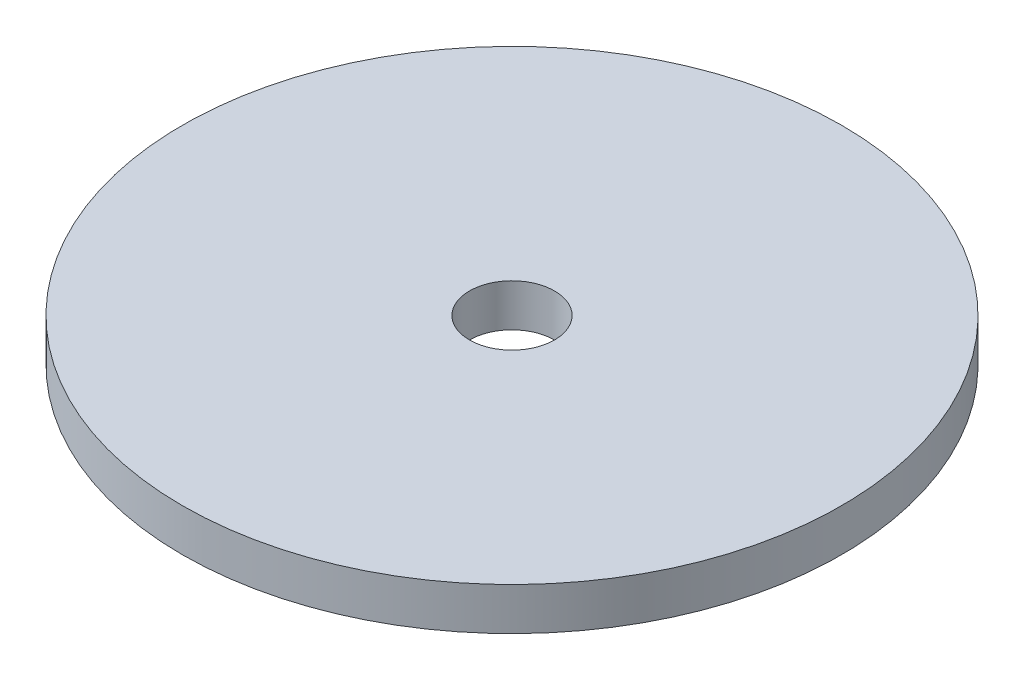
ISO-10303-21;
HEADER;
FILE_DESCRIPTION(('STEP AP214'),'2;1');
FILE_NAME('part.step','',(''),(''),'','','');
FILE_SCHEMA(('AUTOMOTIVE_DESIGN { 1 0 10303 214 1 1 1 1 }'));
ENDSEC;
DATA;
#1=APPLICATION_CONTEXT('core data for automotive mechanical design processes');
#2=APPLICATION_PROTOCOL_DEFINITION('international standard','automotive_design',2000,#1);
#3=PRODUCT_CONTEXT('',#1,'mechanical');
#4=PRODUCT('Part','Part','',(#3));
#5=PRODUCT_RELATED_PRODUCT_CATEGORY('part','',(#4));
#6=PRODUCT_DEFINITION_FORMATION('','',#4);
#7=PRODUCT_DEFINITION_CONTEXT('part definition',#1,'design');
#8=PRODUCT_DEFINITION('design','',#6,#7);
#9=PRODUCT_DEFINITION_SHAPE('','',#8);
#10=(LENGTH_UNIT() NAMED_UNIT(*) SI_UNIT(.MILLI.,.METRE.));
#11=(NAMED_UNIT(*) PLANE_ANGLE_UNIT() SI_UNIT($,.RADIAN.));
#12=(NAMED_UNIT(*) SI_UNIT($,.STERADIAN.) SOLID_ANGLE_UNIT());
#13=UNCERTAINTY_MEASURE_WITH_UNIT(LENGTH_MEASURE(1.E-05),#10,'distance_accuracy_value','');
#14=(GEOMETRIC_REPRESENTATION_CONTEXT(3) GLOBAL_UNCERTAINTY_ASSIGNED_CONTEXT((#13)) GLOBAL_UNIT_ASSIGNED_CONTEXT((#10,
#11,#12)) REPRESENTATION_CONTEXT('',''));
#15=CARTESIAN_POINT('',(0.,0.,0.));
#16=DIRECTION('',(0.,0.,1.));
#17=DIRECTION('',(1.,0.,0.));
#18=AXIS2_PLACEMENT_3D('',#15,#16,#17);
#19=CARTESIAN_POINT('',(0.,25.4,0.));
#20=DIRECTION('',(0.,1.,0.));
#21=DIRECTION('',(0.,0.,1.));
#22=AXIS2_PLACEMENT_3D('',#19,#20,#21);
#23=PLANE('',#22);
#24=CARTESIAN_POINT('',(0.,25.4,0.));
#25=DIRECTION('',(0.,1.,0.));
#26=DIRECTION('',(0.,0.,1.));
#27=AXIS2_PLACEMENT_3D('',#24,#25,#26);
#28=CIRCLE('',#27,196.85);
#29=CARTESIAN_POINT('',(0.,25.4,196.85));
#30=VERTEX_POINT('',#29);
#31=EDGE_CURVE('E10',#30,#30,#28,.T.);
#32=ORIENTED_EDGE('',*,*,#31,.T.);
#33=EDGE_LOOP('',(#32));
#34=FACE_BOUND('',#33,.T.);
#35=CARTESIAN_POINT('',(0.,25.4,0.));
#36=DIRECTION('',(0.,1.,0.));
#37=DIRECTION('',(0.,0.,1.));
#38=AXIS2_PLACEMENT_3D('',#35,#36,#37);
#39=CIRCLE('',#38,25.4);
#40=CARTESIAN_POINT('',(0.,25.4,25.4));
#41=VERTEX_POINT('',#40);
#42=EDGE_CURVE('E46',#41,#41,#39,.T.);
#43=ORIENTED_EDGE('',*,*,#42,.F.);
#44=EDGE_LOOP('',(#43));
#45=FACE_BOUND('',#44,.T.);
#46=ADVANCED_FACE('F35',(#34,#45),#23,.T.);
#47=CARTESIAN_POINT('',(0.,0.,0.));
#48=DIRECTION('',(0.,1.,0.));
#49=DIRECTION('',(0.,0.,1.));
#50=AXIS2_PLACEMENT_3D('',#47,#48,#49);
#51=PLANE('',#50);
#52=CARTESIAN_POINT('',(0.,0.,0.));
#53=DIRECTION('',(0.,1.,0.));
#54=DIRECTION('',(0.,0.,1.));
#55=AXIS2_PLACEMENT_3D('',#52,#53,#54);
#56=CIRCLE('',#55,196.85);
#57=CARTESIAN_POINT('',(0.,0.,196.85));
#58=VERTEX_POINT('',#57);
#59=EDGE_CURVE('E39',#58,#58,#56,.T.);
#60=ORIENTED_EDGE('',*,*,#59,.F.);
#61=EDGE_LOOP('',(#60));
#62=FACE_BOUND('',#61,.T.);
#63=CARTESIAN_POINT('',(0.,0.,0.));
#64=DIRECTION('',(0.,1.,0.));
#65=DIRECTION('',(0.,0.,1.));
#66=AXIS2_PLACEMENT_3D('',#63,#64,#65);
#67=CIRCLE('',#66,25.4);
#68=CARTESIAN_POINT('',(0.,0.,25.4));
#69=VERTEX_POINT('',#68);
#70=EDGE_CURVE('E48',#69,#69,#67,.T.);
#71=ORIENTED_EDGE('',*,*,#70,.T.);
#72=EDGE_LOOP('',(#71));
#73=FACE_BOUND('',#72,.T.);
#74=ADVANCED_FACE('F58',(#62,#73),#51,.F.);
#75=CARTESIAN_POINT('',(0.,25.4,0.));
#76=DIRECTION('',(0.,-1.,0.));
#77=DIRECTION('',(0.,0.,-1.));
#78=AXIS2_PLACEMENT_3D('',#75,#76,#77);
#79=CYLINDRICAL_SURFACE('',#78,196.85);
#80=ORIENTED_EDGE('',*,*,#31,.F.);
#81=EDGE_LOOP('',(#80));
#82=FACE_BOUND('',#81,.T.);
#83=ORIENTED_EDGE('',*,*,#59,.T.);
#84=EDGE_LOOP('',(#83));
#85=FACE_BOUND('',#84,.T.);
#86=ADVANCED_FACE('F37',(#82,#85),#79,.T.);
#87=CARTESIAN_POINT('',(0.,25.4,0.));
#88=DIRECTION('',(0.,-1.,0.));
#89=DIRECTION('',(0.,0.,-1.));
#90=AXIS2_PLACEMENT_3D('',#87,#88,#89);
#91=CYLINDRICAL_SURFACE('',#90,25.4);
#92=ORIENTED_EDGE('',*,*,#42,.T.);
#93=EDGE_LOOP('',(#92));
#94=FACE_BOUND('',#93,.T.);
#95=ORIENTED_EDGE('',*,*,#70,.F.);
#96=EDGE_LOOP('',(#95));
#97=FACE_BOUND('',#96,.T.);
#98=ADVANCED_FACE('F54',(#94,#97),#91,.F.);
#99=CLOSED_SHELL('',(#46,#74,#86,#98));
#100=MANIFOLD_SOLID_BREP('B2',#99);
#101=ADVANCED_BREP_SHAPE_REPRESENTATION('',(#18,#100),#14);
#102=SHAPE_DEFINITION_REPRESENTATION(#9,#101);
ENDSEC;
END-ISO-10303-21;
